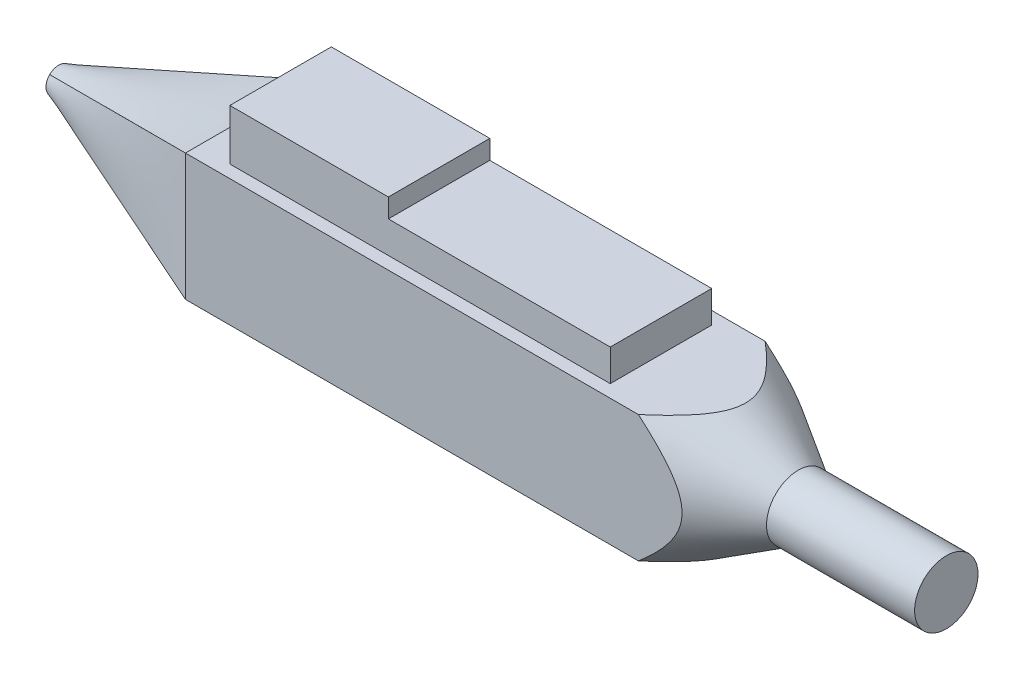
ISO-10303-21;
HEADER;
FILE_DESCRIPTION(('STEP AP214'),'2;1');
FILE_NAME('part.step','',(''),(''),'','','');
FILE_SCHEMA(('AUTOMOTIVE_DESIGN { 1 0 10303 214 1 1 1 1 }'));
ENDSEC;
DATA;
#1=APPLICATION_CONTEXT('core data for automotive mechanical design processes');
#2=APPLICATION_PROTOCOL_DEFINITION('international standard','automotive_design',2000,#1);
#3=PRODUCT_CONTEXT('',#1,'mechanical');
#4=PRODUCT('Part','Part','',(#3));
#5=PRODUCT_RELATED_PRODUCT_CATEGORY('part','',(#4));
#6=PRODUCT_DEFINITION_FORMATION('','',#4);
#7=PRODUCT_DEFINITION_CONTEXT('part definition',#1,'design');
#8=PRODUCT_DEFINITION('design','',#6,#7);
#9=PRODUCT_DEFINITION_SHAPE('','',#8);
#10=(LENGTH_UNIT() NAMED_UNIT(*) SI_UNIT(.MILLI.,.METRE.));
#11=(NAMED_UNIT(*) PLANE_ANGLE_UNIT() SI_UNIT($,.RADIAN.));
#12=(NAMED_UNIT(*) SI_UNIT($,.STERADIAN.) SOLID_ANGLE_UNIT());
#13=UNCERTAINTY_MEASURE_WITH_UNIT(LENGTH_MEASURE(1.E-05),#10,'distance_accuracy_value','');
#14=(GEOMETRIC_REPRESENTATION_CONTEXT(3) GLOBAL_UNCERTAINTY_ASSIGNED_CONTEXT((#13)) GLOBAL_UNIT_ASSIGNED_CONTEXT((#10,
#11,#12)) REPRESENTATION_CONTEXT('',''));
#15=CARTESIAN_POINT('',(0.,0.,0.));
#16=DIRECTION('',(0.,0.,1.));
#17=DIRECTION('',(1.,0.,0.));
#18=AXIS2_PLACEMENT_3D('',#15,#16,#17);
#19=CARTESIAN_POINT('',(0.,15.,0.));
#20=DIRECTION('',(0.,-1.,0.));
#21=DIRECTION('',(0.,0.,-1.));
#22=AXIS2_PLACEMENT_3D('',#19,#20,#21);
#23=PLANE('',#22);
#24=DIRECTION('',(0.,0.,-1.));
#25=VECTOR('',#24,1.);
#26=CARTESIAN_POINT('',(-5.,15.,-8.));
#27=LINE('',#26,#25);
#28=CARTESIAN_POINT('',(-5.,15.,8.));
#29=VERTEX_POINT('',#28);
#30=CARTESIAN_POINT('',(-5.,15.,-8.));
#31=VERTEX_POINT('',#30);
#32=EDGE_CURVE('E100',#29,#31,#27,.T.);
#33=ORIENTED_EDGE('',*,*,#32,.F.);
#34=DIRECTION('',(1.,0.,0.));
#35=VECTOR('',#34,1.);
#36=CARTESIAN_POINT('',(-30.,15.,8.));
#37=LINE('',#36,#35);
#38=CARTESIAN_POINT('',(30.,15.,8.));
#39=VERTEX_POINT('',#38);
#40=EDGE_CURVE('E224',#29,#39,#37,.T.);
#41=ORIENTED_EDGE('',*,*,#40,.T.);
#42=DIRECTION('',(0.,0.,-1.));
#43=VECTOR('',#42,1.);
#44=CARTESIAN_POINT('',(30.,15.,8.));
#45=LINE('',#44,#43);
#46=CARTESIAN_POINT('',(30.,15.,-8.));
#47=VERTEX_POINT('',#46);
#48=EDGE_CURVE('E216',#39,#47,#45,.T.);
#49=ORIENTED_EDGE('',*,*,#48,.T.);
#50=DIRECTION('',(-1.,0.,0.));
#51=VECTOR('',#50,1.);
#52=CARTESIAN_POINT('',(-30.,15.,-8.));
#53=LINE('',#52,#51);
#54=EDGE_CURVE('E220',#47,#31,#53,.T.);
#55=ORIENTED_EDGE('',*,*,#54,.T.);
#56=EDGE_LOOP('',(#33,#41,#49,#55));
#57=FACE_BOUND('',#56,.T.);
#58=ADVANCED_FACE('F77',(#57),#23,.F.);
#59=CARTESIAN_POINT('',(-35.,10.,-10.));
#60=DIRECTION('',(0.,1.,0.));
#61=DIRECTION('',(0.,0.,1.));
#62=AXIS2_PLACEMENT_3D('',#59,#60,#61);
#63=PLANE('',#62);
#64=DIRECTION('',(0.,0.,1.));
#65=VECTOR('',#64,1.);
#66=CARTESIAN_POINT('',(-35.,10.,-10.));
#67=LINE('',#66,#65);
#68=CARTESIAN_POINT('',(-35.,10.,-10.));
#69=VERTEX_POINT('',#68);
#70=CARTESIAN_POINT('',(-35.,10.,10.));
#71=VERTEX_POINT('',#70);
#72=EDGE_CURVE('E316',#69,#71,#67,.T.);
#73=ORIENTED_EDGE('',*,*,#72,.T.);
#74=DIRECTION('',(-1.,0.,0.));
#75=VECTOR('',#74,1.);
#76=CARTESIAN_POINT('',(-35.,10.,10.));
#77=LINE('',#76,#75);
#78=CARTESIAN_POINT('',(36.4277260800642,10.,10.));
#79=VERTEX_POINT('',#78);
#80=EDGE_CURVE('E323',#79,#71,#77,.T.);
#81=ORIENTED_EDGE('',*,*,#80,.F.);
#82=CARTESIAN_POINT('',(36.4277260800642,10.,10.));
#83=CARTESIAN_POINT('',(36.6579701905072,10.,9.80431700209805));
#84=CARTESIAN_POINT('',(36.8868402030193,10.,9.60699599659866));
#85=CARTESIAN_POINT('',(37.3412880846106,10.,9.20851020861762));
#86=CARTESIAN_POINT('',(37.5668652790757,10.,9.00734465745292));
#87=CARTESIAN_POINT('',(38.0154089206724,10.,8.59948141561774));
#88=CARTESIAN_POINT('',(38.2383521223816,10.,8.39275809408566));
#89=CARTESIAN_POINT('',(38.6794427460789,10.,7.97427421978591));
#90=CARTESIAN_POINT('',(38.8975904834556,10.,7.76251400020425));
#91=CARTESIAN_POINT('',(39.3358964050225,10.,7.32535955670521));
#92=CARTESIAN_POINT('',(39.5558400347789,10.,7.09974946314896));
#93=CARTESIAN_POINT('',(39.9880225612236,10.,6.64117396667784));
#94=CARTESIAN_POINT('',(40.200260373825,10.,6.40820753739615));
#95=CARTESIAN_POINT('',(40.6144833976441,10.,5.93427125050396));
#96=CARTESIAN_POINT('',(40.816491847635,10.,5.69332179989841));
#97=CARTESIAN_POINT('',(41.2080241019846,10.,5.20153839624695));
#98=CARTESIAN_POINT('',(41.3975526800176,10.,4.95070828202222));
#99=CARTESIAN_POINT('',(41.7078311068682,10.,4.51195125776544));
#100=CARTESIAN_POINT('',(41.8325927164225,10.,4.32686662735559));
#101=CARTESIAN_POINT('',(42.0722419483505,10.,3.95031636208399));
#102=CARTESIAN_POINT('',(42.1871276477973,10.,3.75884949457058));
#103=CARTESIAN_POINT('',(42.4043355985667,10.,3.37009083425741));
#104=CARTESIAN_POINT('',(42.5067160988686,10.,3.17283180864254));
#105=CARTESIAN_POINT('',(42.6970310222163,10.,2.77143710628962));
#106=CARTESIAN_POINT('',(42.7849685182514,10.,2.56730290352717));
#107=CARTESIAN_POINT('',(42.9300306177258,10.,2.18780015311988));
#108=CARTESIAN_POINT('',(42.9898525563668,10.,2.01346640770079));
#109=CARTESIAN_POINT('',(43.0959306438249,10.,1.66069593327497));
#110=CARTESIAN_POINT('',(43.1421881152691,10.,1.48225960612854));
#111=CARTESIAN_POINT('',(43.2195313105477,10.,1.12235331438243));
#112=CARTESIAN_POINT('',(43.2506377885369,10.,0.940887853812675));
#113=CARTESIAN_POINT('',(43.2965725637487,10.,0.575890418109581));
#114=CARTESIAN_POINT('',(43.3114013120031,10.,0.392358500377088));
#115=CARTESIAN_POINT('',(43.3241857413195,10.,0.0238794025062155));
#116=CARTESIAN_POINT('',(43.3220657766808,10.,-0.161070437689557));
#117=CARTESIAN_POINT('',(43.3008653252348,10.,-0.529983521345133));
#118=CARTESIAN_POINT('',(43.2817847963648,10.,-0.71394676235701));
#119=CARTESIAN_POINT('',(43.2274365851684,10.,-1.07959788229485));
#120=CARTESIAN_POINT('',(43.1921555363982,10.,-1.26128375484135));
#121=CARTESIAN_POINT('',(43.1067368123953,10.,-1.62111059711777));
#122=CARTESIAN_POINT('',(43.0565969282474,10.,-1.79925103557839));
#123=CARTESIAN_POINT('',(42.9210531798147,10.,-2.21952676508635));
#124=CARTESIAN_POINT('',(42.8295146187087,10.,-2.45968492459424));
#125=CARTESIAN_POINT('',(42.625445706637,10.,-2.93089198921819));
#126=CARTESIAN_POINT('',(42.5129041744265,10.,-3.16193596252655));
#127=CARTESIAN_POINT('',(42.2698580028304,10.,-3.61699418346018));
#128=CARTESIAN_POINT('',(42.1391991859239,10.,-3.84092530466756));
#129=CARTESIAN_POINT('',(41.8642311877281,10.,-4.28007549301963));
#130=CARTESIAN_POINT('',(41.7199257143812,10.,-4.4952969041205));
#131=CARTESIAN_POINT('',(41.387598227494,10.,-4.9642071843985));
#132=CARTESIAN_POINT('',(41.1969208253946,10.,-5.2160053568361));
#133=CARTESIAN_POINT('',(40.8030399890308,10.,-5.70966391819909));
#134=CARTESIAN_POINT('',(40.5998319962701,10.,-5.9515206365656));
#135=CARTESIAN_POINT('',(40.1831932466239,10.,-6.42720957716263));
#136=CARTESIAN_POINT('',(39.9697399036085,10.,-6.6610219171918));
#137=CARTESIAN_POINT('',(39.5351066951517,10.,-7.12125821387428));
#138=CARTESIAN_POINT('',(39.3139278800305,10.,-7.34768316685006));
#139=CARTESIAN_POINT('',(38.8761273606315,10.,-7.78348401085992));
#140=CARTESIAN_POINT('',(38.6597991706379,10.,-7.99315582198255));
#141=CARTESIAN_POINT('',(38.2224584034069,10.,-8.40757183318024));
#142=CARTESIAN_POINT('',(38.0014455424798,10.,-8.61231573322305));
#143=CARTESIAN_POINT('',(37.5568037805587,10.,-9.0163492750656));
#144=CARTESIAN_POINT('',(37.333197095975,10.,-9.21566342931389));
#145=CARTESIAN_POINT('',(36.8827520578375,10.,-9.61052105445092));
#146=CARTESIAN_POINT('',(36.6559143331247,10.,-9.80606524209425));
#147=CARTESIAN_POINT('',(36.4277260800642,10.,-10.));
#148=B_SPLINE_CURVE_WITH_KNOTS('',3,(#82,#83,#84,#85,#86,#87,#88,#89,#90,#91,#92,#93,#94,#95,
#96,#97,#98,#99,#100,#101,#102,#103,#104,#105,#106,#107,#108,#109,#110,#111,#112,#113,#114,#115,
#116,#117,#118,#119,#120,#121,#122,#123,#124,#125,#126,#127,#128,#129,#130,#131,#132,#133,#134,
#135,#136,#137,#138,#139,#140,#141,#142,#143,#144,#145,#146,#147),.UNSPECIFIED.,.F.,.F.,(4,2,2,
2,2,2,2,2,2,2,2,2,2,2,2,2,2,2,2,2,2,2,2,2,2,2,2,2,2,2,2,2,4),(0.,0.906510326435434,
1.81320383818188,2.72524506526281,3.63722612854821,4.58231754932622,5.52754141840162,
6.47051158573985,7.41311893683248,8.08249124235044,8.75199358673786,9.4182477538633,
10.0843599801869,10.6368167197363,11.1892195731001,11.7408635901011,12.292492321473,
12.8465844587537,13.4006779701991,13.9552294672094,14.5098634452661,15.2796143983178,
16.0497763148183,16.8269482925417,17.6039097077498,18.5509258702119,19.4982886031892,
20.4478454472875,21.397273692627,22.3009782796597,23.2047377496095,24.1033239435833,
25.0017375771655),.UNSPECIFIED.);
#149=CARTESIAN_POINT('',(36.4277260800642,10.,-10.));
#150=VERTEX_POINT('',#149);
#151=EDGE_CURVE('E93',#79,#150,#148,.T.);
#152=ORIENTED_EDGE('',*,*,#151,.T.);
#153=DIRECTION('',(-1.,0.,0.));
#154=VECTOR('',#153,1.);
#155=CARTESIAN_POINT('',(-35.,10.,-10.));
#156=LINE('',#155,#154);
#157=EDGE_CURVE('E318',#150,#69,#156,.T.);
#158=ORIENTED_EDGE('',*,*,#157,.T.);
#159=EDGE_LOOP('',(#73,#81,#152,#158));
#160=FACE_BOUND('',#159,.T.);
#161=DIRECTION('',(-1.,0.,0.));
#162=VECTOR('',#161,1.);
#163=CARTESIAN_POINT('',(-30.,10.,-8.));
#164=LINE('',#163,#162);
#165=CARTESIAN_POINT('',(30.,10.,-8.));
#166=VERTEX_POINT('',#165);
#167=CARTESIAN_POINT('',(-30.,10.,-8.));
#168=VERTEX_POINT('',#167);
#169=EDGE_CURVE('E230',#166,#168,#164,.T.);
#170=ORIENTED_EDGE('',*,*,#169,.F.);
#171=DIRECTION('',(0.,0.,-1.));
#172=VECTOR('',#171,1.);
#173=CARTESIAN_POINT('',(30.,10.,8.));
#174=LINE('',#173,#172);
#175=CARTESIAN_POINT('',(30.,10.,8.));
#176=VERTEX_POINT('',#175);
#177=EDGE_CURVE('E215',#176,#166,#174,.T.);
#178=ORIENTED_EDGE('',*,*,#177,.F.);
#179=DIRECTION('',(1.,0.,0.));
#180=VECTOR('',#179,1.);
#181=CARTESIAN_POINT('',(-30.,10.,8.));
#182=LINE('',#181,#180);
#183=CARTESIAN_POINT('',(-30.,10.,8.));
#184=VERTEX_POINT('',#183);
#185=EDGE_CURVE('E221',#184,#176,#182,.T.);
#186=ORIENTED_EDGE('',*,*,#185,.F.);
#187=DIRECTION('',(0.,0.,1.));
#188=VECTOR('',#187,1.);
#189=CARTESIAN_POINT('',(-30.,10.,8.));
#190=LINE('',#189,#188);
#191=EDGE_CURVE('E180',#168,#184,#190,.T.);
#192=ORIENTED_EDGE('',*,*,#191,.F.);
#193=EDGE_LOOP('',(#170,#178,#186,#192));
#194=FACE_BOUND('',#193,.T.);
#195=ADVANCED_FACE('F372',(#160,#194),#63,.T.);
#196=CARTESIAN_POINT('',(-35.,-10.,-10.));
#197=DIRECTION('',(0.,-1.,0.));
#198=DIRECTION('',(0.,0.,-1.));
#199=AXIS2_PLACEMENT_3D('',#196,#197,#198);
#200=PLANE('',#199);
#201=DIRECTION('',(1.,0.,0.));
#202=VECTOR('',#201,1.);
#203=CARTESIAN_POINT('',(-35.,-10.,-10.));
#204=LINE('',#203,#202);
#205=CARTESIAN_POINT('',(-35.,-10.,-10.));
#206=VERTEX_POINT('',#205);
#207=CARTESIAN_POINT('',(36.4277260800642,-10.,-10.));
#208=VERTEX_POINT('',#207);
#209=EDGE_CURVE('E308',#206,#208,#204,.T.);
#210=ORIENTED_EDGE('',*,*,#209,.T.);
#211=CARTESIAN_POINT('',(36.4277260800642,-10.,-10.));
#212=CARTESIAN_POINT('',(36.6579701905072,-10.,-9.80431700209805));
#213=CARTESIAN_POINT('',(36.8868402030193,-10.,-9.60699599659866));
#214=CARTESIAN_POINT('',(37.3412880846106,-10.,-9.20851020861763));
#215=CARTESIAN_POINT('',(37.5668652790757,-10.,-9.00734465745293));
#216=CARTESIAN_POINT('',(38.0154089206724,-10.,-8.59948141561774));
#217=CARTESIAN_POINT('',(38.2383521223816,-10.,-8.39275809408566));
#218=CARTESIAN_POINT('',(38.6794427460789,-10.,-7.97427421978591));
#219=CARTESIAN_POINT('',(38.8975904834556,-10.,-7.76251400020426));
#220=CARTESIAN_POINT('',(39.3358964050225,-10.,-7.32535955670522));
#221=CARTESIAN_POINT('',(39.5558400347789,-10.,-7.09974946314897));
#222=CARTESIAN_POINT('',(39.9880225612237,-10.,-6.64117396667784));
#223=CARTESIAN_POINT('',(40.200260373825,-10.,-6.40820753739615));
#224=CARTESIAN_POINT('',(40.6144833976441,-10.,-5.93427125050396));
#225=CARTESIAN_POINT('',(40.816491847635,-10.,-5.69332179989841));
#226=CARTESIAN_POINT('',(41.2080241019846,-10.,-5.20153839624695));
#227=CARTESIAN_POINT('',(41.3975526800176,-10.,-4.95070828202222));
#228=CARTESIAN_POINT('',(41.7078311068682,-10.,-4.51195125776544));
#229=CARTESIAN_POINT('',(41.8325927164226,-10.,-4.32686662735559));
#230=CARTESIAN_POINT('',(42.0722419483505,-10.,-3.95031636208399));
#231=CARTESIAN_POINT('',(42.1871276477974,-10.,-3.75884949457058));
#232=CARTESIAN_POINT('',(42.4043355985667,-10.,-3.37009083425741));
#233=CARTESIAN_POINT('',(42.5067160988686,-10.,-3.17283180864255));
#234=CARTESIAN_POINT('',(42.6970310222164,-10.,-2.77143710628962));
#235=CARTESIAN_POINT('',(42.7849685182514,-10.,-2.56730290352717));
#236=CARTESIAN_POINT('',(42.9300306177258,-10.,-2.18780015311989));
#237=CARTESIAN_POINT('',(42.9898525563668,-10.,-2.0134664077008));
#238=CARTESIAN_POINT('',(43.0959306438249,-10.,-1.66069593327497));
#239=CARTESIAN_POINT('',(43.1421881152691,-10.,-1.48225960612855));
#240=CARTESIAN_POINT('',(43.2195313105477,-10.,-1.12235331438243));
#241=CARTESIAN_POINT('',(43.2506377885369,-10.,-0.940887853812678));
#242=CARTESIAN_POINT('',(43.2965725637487,-10.,-0.575890418109582));
#243=CARTESIAN_POINT('',(43.3114013120031,-10.,-0.392358500377087));
#244=CARTESIAN_POINT('',(43.3241857413195,-10.,-0.023879402506213));
#245=CARTESIAN_POINT('',(43.3220657766808,-10.,0.16107043768956));
#246=CARTESIAN_POINT('',(43.3008653252348,-10.,0.529983521345135));
#247=CARTESIAN_POINT('',(43.2817847963648,-10.,0.713946762357011));
#248=CARTESIAN_POINT('',(43.2274365851684,-10.,1.07959788229485));
#249=CARTESIAN_POINT('',(43.1921555363982,-10.,1.26128375484136));
#250=CARTESIAN_POINT('',(43.1067368123954,-10.,1.62111059711777));
#251=CARTESIAN_POINT('',(43.0565969282474,-10.,1.79925103557839));
#252=CARTESIAN_POINT('',(42.9210531798147,-10.,2.21952676508635));
#253=CARTESIAN_POINT('',(42.8295146187087,-10.,2.45968492459425));
#254=CARTESIAN_POINT('',(42.625445706637,-10.,2.93089198921819));
#255=CARTESIAN_POINT('',(42.5129041744265,-10.,3.16193596252655));
#256=CARTESIAN_POINT('',(42.2698580028304,-10.,3.61699418346018));
#257=CARTESIAN_POINT('',(42.1391991859239,-10.,3.84092530466756));
#258=CARTESIAN_POINT('',(41.8642311877281,-10.,4.28007549301964));
#259=CARTESIAN_POINT('',(41.7199257143812,-10.,4.49529690412051));
#260=CARTESIAN_POINT('',(41.387598227494,-10.,4.96420718439851));
#261=CARTESIAN_POINT('',(41.1969208253946,-10.,5.2160053568361));
#262=CARTESIAN_POINT('',(40.8030399890308,-10.,5.7096639181991));
#263=CARTESIAN_POINT('',(40.5998319962701,-10.,5.9515206365656));
#264=CARTESIAN_POINT('',(40.1831932466239,-10.,6.42720957716264));
#265=CARTESIAN_POINT('',(39.9697399036085,-10.,6.6610219171918));
#266=CARTESIAN_POINT('',(39.5351066951517,-10.,7.12125821387428));
#267=CARTESIAN_POINT('',(39.3139278800305,-10.,7.34768316685006));
#268=CARTESIAN_POINT('',(38.8761273606315,-10.,7.78348401085992));
#269=CARTESIAN_POINT('',(38.6597991706379,-10.,7.99315582198255));
#270=CARTESIAN_POINT('',(38.2224584034069,-10.,8.40757183318024));
#271=CARTESIAN_POINT('',(38.0014455424798,-10.,8.61231573322304));
#272=CARTESIAN_POINT('',(37.5568037805587,-10.,9.0163492750656));
#273=CARTESIAN_POINT('',(37.333197095975,-10.,9.21566342931389));
#274=CARTESIAN_POINT('',(36.8827520578375,-10.,9.61052105445092));
#275=CARTESIAN_POINT('',(36.6559143331247,-10.,9.80606524209425));
#276=CARTESIAN_POINT('',(36.4277260800642,-10.,10.));
#277=B_SPLINE_CURVE_WITH_KNOTS('',3,(#211,#212,#213,#214,#215,#216,#217,#218,#219,#220,#221,
#222,#223,#224,#225,#226,#227,#228,#229,#230,#231,#232,#233,#234,#235,#236,#237,#238,#239,#240,
#241,#242,#243,#244,#245,#246,#247,#248,#249,#250,#251,#252,#253,#254,#255,#256,#257,#258,#259,
#260,#261,#262,#263,#264,#265,#266,#267,#268,#269,#270,#271,#272,#273,#274,#275,#276),
.UNSPECIFIED.,.F.,.F.,(4,2,2,2,2,2,2,2,2,2,2,2,2,2,2,2,2,2,2,2,2,2,2,2,2,2,2,2,2,2,2,2,4),(0.,
0.906510326435433,1.81320383818187,2.72524506526281,3.63722612854821,4.58231754932622,
5.52754141840163,6.47051158573986,7.41311893683249,8.08249124235045,8.75199358673786,
9.4182477538633,10.0843599801869,10.6368167197363,11.1892195731001,11.7408635901011,
12.292492321473,12.8465844587537,13.4006779701991,13.9552294672094,14.5098634452661,
15.2796143983178,16.0497763148183,16.8269482925417,17.6039097077498,18.5509258702119,
19.4982886031892,20.4478454472875,21.397273692627,22.3009782796597,23.2047377496095,
24.1033239435833,25.0017375771655),.UNSPECIFIED.);
#278=CARTESIAN_POINT('',(36.4277260800642,-10.,10.));
#279=VERTEX_POINT('',#278);
#280=EDGE_CURVE('E354',#208,#279,#277,.T.);
#281=ORIENTED_EDGE('',*,*,#280,.T.);
#282=DIRECTION('',(1.,0.,0.));
#283=VECTOR('',#282,1.);
#284=CARTESIAN_POINT('',(-35.,-10.,10.));
#285=LINE('',#284,#283);
#286=CARTESIAN_POINT('',(-35.,-10.,10.));
#287=VERTEX_POINT('',#286);
#288=EDGE_CURVE('E322',#287,#279,#285,.T.);
#289=ORIENTED_EDGE('',*,*,#288,.F.);
#290=DIRECTION('',(0.,0.,-1.));
#291=VECTOR('',#290,1.);
#292=CARTESIAN_POINT('',(-35.,-10.,-10.));
#293=LINE('',#292,#291);
#294=EDGE_CURVE('E331',#206,#287,#293,.F.);
#295=ORIENTED_EDGE('',*,*,#294,.F.);
#296=EDGE_LOOP('',(#210,#281,#289,#295));
#297=FACE_BOUND('',#296,.T.);
#298=ADVANCED_FACE('F365',(#297),#200,.T.);
#299=CARTESIAN_POINT('',(0.,0.,-10.));
#300=DIRECTION('',(0.,0.,-1.));
#301=DIRECTION('',(-1.,0.,0.));
#302=AXIS2_PLACEMENT_3D('',#299,#300,#301);
#303=PLANE('',#302);
#304=ORIENTED_EDGE('',*,*,#157,.F.);
#305=CARTESIAN_POINT('',(36.4277260800642,10.,-10.));
#306=CARTESIAN_POINT('',(36.6583803846559,9.80396813106534,-10.));
#307=CARTESIAN_POINT('',(36.887655979535,9.6062925015474,-10.));
#308=CARTESIAN_POINT('',(37.3429033595852,9.20708185003049,-10.));
#309=CARTESIAN_POINT('',(37.5688744500061,9.00554603645456,-10.));
#310=CARTESIAN_POINT('',(38.0179821265151,8.59711285705338,-10.));
#311=CARTESIAN_POINT('',(38.2410990763051,8.39019384417617,-10.));
#312=CARTESIAN_POINT('',(38.6825249799105,7.9713074534069,-10.));
#313=CARTESIAN_POINT('',(38.900834269766,7.75934043052419,-10.));
#314=CARTESIAN_POINT('',(39.3265832332469,7.33458702738383,-10.));
#315=CARTESIAN_POINT('',(39.5341577359293,7.12193617499052,-10.));
#316=CARTESIAN_POINT('',(39.9424841124613,6.69018847009781,-10.));
#317=CARTESIAN_POINT('',(40.1432365302668,6.47109213413733,-10.));
#318=CARTESIAN_POINT('',(40.5359389889621,6.02579655908473,-10.));
#319=CARTESIAN_POINT('',(40.7279037618115,5.79961036531046,-10.));
#320=CARTESIAN_POINT('',(41.1011720477513,5.33864784235459,-10.));
#321=CARTESIAN_POINT('',(41.2824787958828,5.10387415521047,-10.));
#322=CARTESIAN_POINT('',(41.5790938428082,4.69641419770352,-10.));
#323=CARTESIAN_POINT('',(41.6978705690616,4.52625618051693,-10.));
#324=CARTESIAN_POINT('',(41.9274457873825,4.18067397582406,-10.));
#325=CARTESIAN_POINT('',(42.0382461440293,4.00525103273687,-10.));
#326=CARTESIAN_POINT('',(42.251148874324,3.64734284402808,-10.));
#327=CARTESIAN_POINT('',(42.3531787142197,3.46481404495236,-10.));
#328=CARTESIAN_POINT('',(42.5457077681673,3.09352526517441,-10.));
#329=CARTESIAN_POINT('',(42.6361934198317,2.90475827745122,-10.));
#330=CARTESIAN_POINT('',(42.7198440490223,2.71286572143321,-10.));
#331=B_SPLINE_CURVE_WITH_KNOTS('',3,(#305,#306,#307,#308,#309,#310,#311,#312,#313,#314,#315,
#316,#317,#318,#319,#320,#321,#322,#323,#324,#325,#326,#327,#328,#329,#330),.UNSPECIFIED.,.F.,
.F.,(4,2,2,2,2,2,2,2,2,2,2,2,4),(0.,0.908126124435932,1.81644050814374,2.72926333478714,
3.64202215418167,4.53339776252417,5.4247021298795,6.31445302937457,7.2039324523734,
7.82628776799343,8.44849712439866,9.07543702499829,9.70310681678607),.UNSPECIFIED.);
#332=CARTESIAN_POINT('',(42.7198440490223,2.71286572143326,-10.));
#333=VERTEX_POINT('',#332);
#334=EDGE_CURVE('E12',#150,#333,#331,.T.);
#335=ORIENTED_EDGE('',*,*,#334,.T.);
#336=CARTESIAN_POINT('',(42.7198440490223,2.71286572143326,-10.));
#337=CARTESIAN_POINT('',(42.7943721442816,2.54189083301518,-10.));
#338=CARTESIAN_POINT('',(42.8633902616501,2.36838901737678,-10.));
#339=CARTESIAN_POINT('',(42.9887707598742,2.01659800696181,-10.));
#340=CARTESIAN_POINT('',(43.0451141223097,1.83830206147723,-10.));
#341=CARTESIAN_POINT('',(43.1431861372235,1.4780351518557,-10.));
#342=CARTESIAN_POINT('',(43.1849415912515,1.29607158383614,-10.));
#343=CARTESIAN_POINT('',(43.2524432025641,0.929269990598683,-10.));
#344=CARTESIAN_POINT('',(43.2781977191863,0.744433518090476,-10.));
#345=CARTESIAN_POINT('',(43.3128333514659,0.371399012504267,-10.));
#346=CARTESIAN_POINT('',(43.3215523976911,0.183185721497938,-10.));
#347=CARTESIAN_POINT('',(43.3212382135592,-0.19324753429364,-10.));
#348=CARTESIAN_POINT('',(43.3122028248433,-0.381467497108377,-10.));
#349=CARTESIAN_POINT('',(43.2768350019264,-0.755661389465241,-10.));
#350=CARTESIAN_POINT('',(43.2505569460959,-0.941640514340922,-10.));
#351=CARTESIAN_POINT('',(43.1818533042049,-1.31056998810603,-10.));
#352=CARTESIAN_POINT('',(43.1394259810083,-1.49352000895239,-10.));
#353=CARTESIAN_POINT('',(43.0265184131462,-1.90430879805331,-10.));
#354=CARTESIAN_POINT('',(42.9515552704378,-2.13091404868043,-10.));
#355=CARTESIAN_POINT('',(42.7816694484503,-2.57649327736518,-10.));
#356=CARTESIAN_POINT('',(42.6867383674268,-2.79546399774958,-10.));
#357=CARTESIAN_POINT('',(42.4791367575941,-3.22819286972412,-10.));
#358=CARTESIAN_POINT('',(42.3662554703809,-3.44184895569871,-10.));
#359=CARTESIAN_POINT('',(42.1268555859097,-3.86121883457495,-10.));
#360=CARTESIAN_POINT('',(42.0003408481684,-4.06693485296339,-10.));
#361=CARTESIAN_POINT('',(41.6817138722408,-4.55457620055053,-10.));
#362=CARTESIAN_POINT('',(41.4840889514337,-4.83288818055061,-10.));
#363=CARTESIAN_POINT('',(41.0722928320057,-5.37707765887001,-10.));
#364=CARTESIAN_POINT('',(40.858111871709,-5.64294767062674,-10.));
#365=CARTESIAN_POINT('',(40.41646432822,-6.16494068297616,-10.));
#366=CARTESIAN_POINT('',(40.1889540252618,-6.42102646587357,-10.));
#367=CARTESIAN_POINT('',(39.7242451928393,-6.92409427661164,-10.));
#368=CARTESIAN_POINT('',(39.4870487927675,-7.17107828291528,-10.));
#369=CARTESIAN_POINT('',(39.0206239730129,-7.64163300291066,-10.));
#370=CARTESIAN_POINT('',(38.7918770530502,-7.86568311134921,-10.));
#371=CARTESIAN_POINT('',(38.3289067277146,-8.30807627051551,-10.));
#372=CARTESIAN_POINT('',(38.0946828700114,-8.52641884669238,-10.));
#373=CARTESIAN_POINT('',(37.6237199633797,-8.95637438829246,-10.));
#374=CARTESIAN_POINT('',(37.3870181713797,-9.16802828626374,-10.));
#375=CARTESIAN_POINT('',(36.9099559910074,-9.58705540952215,-10.));
#376=CARTESIAN_POINT('',(36.6695965258582,-9.79442968487262,-10.));
#377=CARTESIAN_POINT('',(36.4277260800642,-10.,-10.));
#378=B_SPLINE_CURVE_WITH_KNOTS('',3,(#336,#337,#338,#339,#340,#341,#342,#343,#344,#345,#346,
#347,#348,#349,#350,#351,#352,#353,#354,#355,#356,#357,#358,#359,#360,#361,#362,#363,#364,#365,
#366,#367,#368,#369,#370,#371,#372,#373,#374,#375,#376,#377),.UNSPECIFIED.,.F.,.F.,(4,2,2,2,2,2,
2,2,2,2,2,2,2,2,2,2,2,2,2,2,4),(0.,0.559611595533989,1.12005736676538,1.67946797945524,
2.23858609408699,2.8029980472093,3.36747861861951,3.9301874834116,4.4929568944929,
5.20784532750737,5.92303516209302,6.64734425899415,7.37144884598802,8.39460104731888,
9.4183611839631,10.4456909170785,11.472796005142,12.4332623194178,13.3938082389665,
14.34634490288,15.2986450014383),.UNSPECIFIED.);
#379=EDGE_CURVE('E346',#333,#208,#378,.T.);
#380=ORIENTED_EDGE('',*,*,#379,.T.);
#381=ORIENTED_EDGE('',*,*,#209,.F.);
#382=DIRECTION('',(0.,1.,0.));
#383=VECTOR('',#382,1.);
#384=CARTESIAN_POINT('',(-35.,0.,-10.));
#385=LINE('',#384,#383);
#386=EDGE_CURVE('E317',#69,#206,#385,.F.);
#387=ORIENTED_EDGE('',*,*,#386,.F.);
#388=EDGE_LOOP('',(#304,#335,#380,#381,#387));
#389=FACE_BOUND('',#388,.T.);
#390=ADVANCED_FACE('F361',(#389),#303,.T.);
#391=CARTESIAN_POINT('',(0.,0.,10.));
#392=DIRECTION('',(0.,0.,-1.));
#393=DIRECTION('',(-1.,0.,0.));
#394=AXIS2_PLACEMENT_3D('',#391,#392,#393);
#395=PLANE('',#394);
#396=ORIENTED_EDGE('',*,*,#288,.T.);
#397=CARTESIAN_POINT('',(36.4277260800642,-10.,10.));
#398=CARTESIAN_POINT('',(36.6579701905072,-9.80431700209804,10.));
#399=CARTESIAN_POINT('',(36.8868402030193,-9.60699599659866,10.));
#400=CARTESIAN_POINT('',(37.3412880846106,-9.20851020861762,10.));
#401=CARTESIAN_POINT('',(37.5668652790757,-9.00734465745292,10.));
#402=CARTESIAN_POINT('',(38.0154089206724,-8.59948141561774,10.));
#403=CARTESIAN_POINT('',(38.2383521223816,-8.39275809408566,10.));
#404=CARTESIAN_POINT('',(38.6794427460789,-7.97427421978591,10.));
#405=CARTESIAN_POINT('',(38.8975904834556,-7.76251400020426,10.));
#406=CARTESIAN_POINT('',(39.3358964050225,-7.32535955670521,10.));
#407=CARTESIAN_POINT('',(39.5558400347789,-7.09974946314896,10.));
#408=CARTESIAN_POINT('',(39.9880225612236,-6.64117396667784,10.));
#409=CARTESIAN_POINT('',(40.200260373825,-6.40820753739615,10.));
#410=CARTESIAN_POINT('',(40.6144833976441,-5.93427125050396,10.));
#411=CARTESIAN_POINT('',(40.816491847635,-5.69332179989841,10.));
#412=CARTESIAN_POINT('',(41.2080241019846,-5.20153839624695,10.));
#413=CARTESIAN_POINT('',(41.3975526800176,-4.95070828202222,10.));
#414=CARTESIAN_POINT('',(41.7078311068682,-4.51195125776545,10.));
#415=CARTESIAN_POINT('',(41.8325927164225,-4.3268666273556,10.));
#416=CARTESIAN_POINT('',(42.0722419483505,-3.950316362084,10.));
#417=CARTESIAN_POINT('',(42.1871276477973,-3.75884949457059,10.));
#418=CARTESIAN_POINT('',(42.4043355985667,-3.37009083425742,10.));
#419=CARTESIAN_POINT('',(42.5067160988686,-3.17283180864255,10.));
#420=CARTESIAN_POINT('',(42.6970310222163,-2.77143710628963,10.));
#421=CARTESIAN_POINT('',(42.7849685182514,-2.56730290352718,10.));
#422=CARTESIAN_POINT('',(42.9300306177258,-2.18780015311989,10.));
#423=CARTESIAN_POINT('',(42.9898525563668,-2.0134664077008,10.));
#424=CARTESIAN_POINT('',(43.0959306438249,-1.66069593327498,10.));
#425=CARTESIAN_POINT('',(43.1421881152691,-1.48225960612855,10.));
#426=CARTESIAN_POINT('',(43.2195313105477,-1.12235331438243,10.));
#427=CARTESIAN_POINT('',(43.2506377885369,-0.940887853812679,10.));
#428=CARTESIAN_POINT('',(43.2965725637487,-0.575890418109583,10.));
#429=CARTESIAN_POINT('',(43.3114013120031,-0.392358500377089,10.));
#430=CARTESIAN_POINT('',(43.3241857413195,-0.0238794025062159,10.));
#431=CARTESIAN_POINT('',(43.3220657766808,0.161070437689557,10.));
#432=CARTESIAN_POINT('',(43.3008653252348,0.529983521345133,10.));
#433=CARTESIAN_POINT('',(43.2817847963648,0.713946762357009,10.));
#434=CARTESIAN_POINT('',(43.2274365851684,1.07959788229485,10.));
#435=CARTESIAN_POINT('',(43.1921555363982,1.26128375484135,10.));
#436=CARTESIAN_POINT('',(43.1067368123953,1.62111059711777,10.));
#437=CARTESIAN_POINT('',(43.0565969282474,1.79925103557839,10.));
#438=CARTESIAN_POINT('',(42.9210531798147,2.21952676508635,10.));
#439=CARTESIAN_POINT('',(42.8295146187087,2.45968492459424,10.));
#440=CARTESIAN_POINT('',(42.625445706637,2.93089198921819,10.));
#441=CARTESIAN_POINT('',(42.5129041744265,3.16193596252655,10.));
#442=CARTESIAN_POINT('',(42.2698580028304,3.61699418346018,10.));
#443=CARTESIAN_POINT('',(42.1391991859239,3.84092530466756,10.));
#444=CARTESIAN_POINT('',(41.8642311877281,4.28007549301963,10.));
#445=CARTESIAN_POINT('',(41.7199257143812,4.49529690412051,10.));
#446=CARTESIAN_POINT('',(41.387598227494,4.96420718439851,10.));
#447=CARTESIAN_POINT('',(41.1969208253946,5.2160053568361,10.));
#448=CARTESIAN_POINT('',(40.8030399890308,5.7096639181991,10.));
#449=CARTESIAN_POINT('',(40.5998319962701,5.9515206365656,10.));
#450=CARTESIAN_POINT('',(40.1831932466239,6.42720957716264,10.));
#451=CARTESIAN_POINT('',(39.9697399036085,6.6610219171918,10.));
#452=CARTESIAN_POINT('',(39.5351066951517,7.12125821387428,10.));
#453=CARTESIAN_POINT('',(39.3139278800305,7.34768316685006,10.));
#454=CARTESIAN_POINT('',(38.8761273606315,7.78348401085992,10.));
#455=CARTESIAN_POINT('',(38.6597991706379,7.99315582198255,10.));
#456=CARTESIAN_POINT('',(38.2224584034069,8.40757183318024,10.));
#457=CARTESIAN_POINT('',(38.0014455424798,8.61231573322304,10.));
#458=CARTESIAN_POINT('',(37.5568037805587,9.0163492750656,10.));
#459=CARTESIAN_POINT('',(37.333197095975,9.21566342931388,10.));
#460=CARTESIAN_POINT('',(36.8827520578375,9.61052105445091,10.));
#461=CARTESIAN_POINT('',(36.6559143331247,9.80606524209424,10.));
#462=CARTESIAN_POINT('',(36.4277260800642,10.,10.));
#463=B_SPLINE_CURVE_WITH_KNOTS('',3,(#397,#398,#399,#400,#401,#402,#403,#404,#405,#406,#407,
#408,#409,#410,#411,#412,#413,#414,#415,#416,#417,#418,#419,#420,#421,#422,#423,#424,#425,#426,
#427,#428,#429,#430,#431,#432,#433,#434,#435,#436,#437,#438,#439,#440,#441,#442,#443,#444,#445,
#446,#447,#448,#449,#450,#451,#452,#453,#454,#455,#456,#457,#458,#459,#460,#461,#462),
.UNSPECIFIED.,.F.,.F.,(4,2,2,2,2,2,2,2,2,2,2,2,2,2,2,2,2,2,2,2,2,2,2,2,2,2,2,2,2,2,2,2,4),(0.,
0.906510326435433,1.81320383818187,2.72524506526281,3.63722612854821,4.58231754932623,
5.52754141840163,6.47051158573986,7.41311893683248,8.08249124235044,8.75199358673785,
9.41824775386329,10.0843599801869,10.6368167197363,11.1892195731001,11.7408635901011,
12.292492321473,12.8465844587537,13.4006779701991,13.9552294672094,14.5098634452661,
15.2796143983178,16.0497763148183,16.8269482925417,17.6039097077498,18.5509258702119,
19.4982886031892,20.4478454472875,21.397273692627,22.3009782796597,23.2047377496095,
24.1033239435833,25.0017375771655),.UNSPECIFIED.);
#464=EDGE_CURVE('E383',#279,#79,#463,.T.);
#465=ORIENTED_EDGE('',*,*,#464,.T.);
#466=ORIENTED_EDGE('',*,*,#80,.T.);
#467=DIRECTION('',(0.,1.,0.));
#468=VECTOR('',#467,1.);
#469=CARTESIAN_POINT('',(-35.,0.,10.));
#470=LINE('',#469,#468);
#471=EDGE_CURVE('E327',#71,#287,#470,.F.);
#472=ORIENTED_EDGE('',*,*,#471,.T.);
#473=EDGE_LOOP('',(#396,#465,#466,#472));
#474=FACE_BOUND('',#473,.T.);
#475=ADVANCED_FACE('F292',(#474),#395,.F.);
#476=CARTESIAN_POINT('',(-65.,0.,0.));
#477=DIRECTION('',(-1.,0.,0.));
#478=DIRECTION('',(0.,0.,1.));
#479=AXIS2_PLACEMENT_3D('',#476,#477,#478);
#480=PLANE('',#479);
#481=CARTESIAN_POINT('',(-65.,0.,0.));
#482=DIRECTION('',(-1.,0.,0.));
#483=DIRECTION('',(0.,0.,1.));
#484=AXIS2_PLACEMENT_3D('',#481,#482,#483);
#485=CIRCLE('',#484,2.);
#486=CARTESIAN_POINT('',(-65.,-1.4142135623731,1.41421356237309));
#487=VERTEX_POINT('',#486);
#488=CARTESIAN_POINT('',(-65.,1.41421356237309,1.41421356237309));
#489=VERTEX_POINT('',#488);
#490=EDGE_CURVE('E262',#487,#489,#485,.T.);
#491=ORIENTED_EDGE('',*,*,#490,.T.);
#492=CARTESIAN_POINT('',(-65.,1.4142135623731,-1.41421356237309));
#493=VERTEX_POINT('',#492);
#494=EDGE_CURVE('E266',#489,#493,#485,.T.);
#495=ORIENTED_EDGE('',*,*,#494,.T.);
#496=CARTESIAN_POINT('',(-65.,-1.41421356237309,-1.4142135623731));
#497=VERTEX_POINT('',#496);
#498=EDGE_CURVE('E270',#493,#497,#485,.T.);
#499=ORIENTED_EDGE('',*,*,#498,.T.);
#500=EDGE_CURVE('E249',#497,#487,#485,.T.);
#501=ORIENTED_EDGE('',*,*,#500,.T.);
#502=EDGE_LOOP('',(#491,#495,#499,#501));
#503=FACE_BOUND('',#502,.T.);
#504=ADVANCED_FACE('F281',(#503),#480,.T.);
#505=CARTESIAN_POINT('',(-65.,1.4142135623731,-1.41421356237309));
#506=CARTESIAN_POINT('',(-35.,10.,-10.));
#507=CARTESIAN_POINT('',(-65.,1.58088022903976,-1.24754689570643));
#508=CARTESIAN_POINT('',(-35.,10.,-8.33333333333334));
#509=CARTESIAN_POINT('',(-65.,1.73031719242092,-1.03735888485985));
#510=CARTESIAN_POINT('',(-35.,10.,-6.66666666666667));
#511=CARTESIAN_POINT('',(-65.,1.94065031957611,-0.551350505136435));
#512=CARTESIAN_POINT('',(-35.,10.,-3.33333333333334));
#513=CARTESIAN_POINT('',(-65.,2.,-0.276142374915397));
#514=CARTESIAN_POINT('',(-35.,10.,-1.66666666666667));
#515=CARTESIAN_POINT('',(-65.,2.,0.276142374915397));
#516=CARTESIAN_POINT('',(-35.,10.,1.66666666666666));
#517=CARTESIAN_POINT('',(-65.,1.94065031957611,0.551350505136435));
#518=CARTESIAN_POINT('',(-35.,10.,3.33333333333333));
#519=CARTESIAN_POINT('',(-65.,1.73031719242092,1.03735888485985));
#520=CARTESIAN_POINT('',(-35.,10.,6.66666666666666));
#521=CARTESIAN_POINT('',(-65.,1.58088022903976,1.24754689570643));
#522=CARTESIAN_POINT('',(-35.,10.,8.33333333333333));
#523=CARTESIAN_POINT('',(-65.,1.4142135623731,1.4142135623731));
#524=CARTESIAN_POINT('',(-35.,10.,10.));
#525=B_SPLINE_SURFACE_WITH_KNOTS('',3,1,((#505,#506),(#507,#508),(#509,#510),(#511,#512),(#513,
#514),(#515,#516),(#517,#518),(#519,#520),(#521,#522),(#523,#524)),.UNSPECIFIED.,.F.,.F.,.F.,(4,
2,2,2,4),(2,2),(0.,0.25,0.5,0.75,1.),(0.,1.),.UNSPECIFIED.);
#526=DIRECTION('',(0.926954566462972,0.265287798167804,0.265287798167804));
#527=VECTOR('',#526,1.);
#528=CARTESIAN_POINT('',(-50.,5.70710678118655,5.70710678118655));
#529=LINE('',#528,#527);
#530=EDGE_CURVE('E411',#489,#71,#529,.T.);
#531=DIRECTION('',(-0.926954566462972,-0.265287798167804,0.265287798167804));
#532=VECTOR('',#531,1.);
#533=CARTESIAN_POINT('',(-50.,5.70710678118655,-5.70710678118655));
#534=LINE('',#533,#532);
#535=EDGE_CURVE('E419',#69,#493,#534,.T.);
#536=ORIENTED_EDGE('',*,*,#494,.F.);
#537=ORIENTED_EDGE('',*,*,#530,.T.);
#538=ORIENTED_EDGE('',*,*,#72,.F.);
#539=ORIENTED_EDGE('',*,*,#535,.T.);
#540=EDGE_LOOP('',(#536,#537,#538,#539));
#541=FACE_BOUND('',#540,.T.);
#542=ADVANCED_FACE('F291',(#541),#525,.T.);
#543=CARTESIAN_POINT('',(-65.,1.4142135623731,1.4142135623731));
#544=CARTESIAN_POINT('',(-35.,10.,10.));
#545=CARTESIAN_POINT('',(-65.,1.24754689570643,1.58088022903976));
#546=CARTESIAN_POINT('',(-35.,8.33333333333334,10.));
#547=CARTESIAN_POINT('',(-65.,1.03735888485985,1.73031719242092));
#548=CARTESIAN_POINT('',(-35.,6.66666666666667,10.));
#549=CARTESIAN_POINT('',(-65.,0.551350505136434,1.94065031957611));
#550=CARTESIAN_POINT('',(-35.,3.33333333333334,10.));
#551=CARTESIAN_POINT('',(-65.,0.276142374915397,2.));
#552=CARTESIAN_POINT('',(-35.,1.66666666666667,10.));
#553=CARTESIAN_POINT('',(-65.,-0.276142374915397,2.));
#554=CARTESIAN_POINT('',(-35.,-1.66666666666666,10.));
#555=CARTESIAN_POINT('',(-65.,-0.551350505136435,1.94065031957611));
#556=CARTESIAN_POINT('',(-35.,-3.33333333333333,10.));
#557=CARTESIAN_POINT('',(-65.,-1.03735888485985,1.73031719242091));
#558=CARTESIAN_POINT('',(-35.,-6.66666666666666,10.));
#559=CARTESIAN_POINT('',(-65.,-1.24754689570643,1.58088022903976));
#560=CARTESIAN_POINT('',(-35.,-8.33333333333333,10.));
#561=CARTESIAN_POINT('',(-65.,-1.4142135623731,1.41421356237309));
#562=CARTESIAN_POINT('',(-35.,-10.,10.));
#563=B_SPLINE_SURFACE_WITH_KNOTS('',3,1,((#543,#544),(#545,#546),(#547,#548),(#549,#550),(#551,
#552),(#553,#554),(#555,#556),(#557,#558),(#559,#560),(#561,#562)),.UNSPECIFIED.,.F.,.F.,.F.,(4,
2,2,2,4),(2,2),(0.,0.25,0.5,0.75,1.),(0.,1.),.UNSPECIFIED.);
#564=DIRECTION('',(0.926954566462972,-0.265287798167804,0.265287798167804));
#565=VECTOR('',#564,1.);
#566=CARTESIAN_POINT('',(-50.,-5.70710678118655,5.70710678118655));
#567=LINE('',#566,#565);
#568=EDGE_CURVE('E412',#487,#287,#567,.T.);
#569=ORIENTED_EDGE('',*,*,#490,.F.);
#570=ORIENTED_EDGE('',*,*,#568,.T.);
#571=ORIENTED_EDGE('',*,*,#471,.F.);
#572=ORIENTED_EDGE('',*,*,#530,.F.);
#573=EDGE_LOOP('',(#569,#570,#571,#572));
#574=FACE_BOUND('',#573,.T.);
#575=ADVANCED_FACE('F410',(#574),#563,.T.);
#576=CARTESIAN_POINT('',(-65.,-1.41421356237309,-1.4142135623731));
#577=CARTESIAN_POINT('',(-35.,-10.,-10.));
#578=CARTESIAN_POINT('',(-65.,-1.24754689570643,-1.58088022903976));
#579=CARTESIAN_POINT('',(-35.,-8.33333333333334,-10.));
#580=CARTESIAN_POINT('',(-65.,-1.03735888485985,-1.73031719242092));
#581=CARTESIAN_POINT('',(-35.,-6.66666666666667,-10.));
#582=CARTESIAN_POINT('',(-65.,-0.551350505136434,-1.94065031957611));
#583=CARTESIAN_POINT('',(-35.,-3.33333333333334,-10.));
#584=CARTESIAN_POINT('',(-65.,-0.276142374915396,-2.));
#585=CARTESIAN_POINT('',(-35.,-1.66666666666668,-10.));
#586=CARTESIAN_POINT('',(-65.,0.276142374915397,-2.));
#587=CARTESIAN_POINT('',(-35.,1.66666666666666,-10.));
#588=CARTESIAN_POINT('',(-65.,0.551350505136435,-1.94065031957611));
#589=CARTESIAN_POINT('',(-35.,3.33333333333332,-10.));
#590=CARTESIAN_POINT('',(-65.,1.03735888485985,-1.73031719242092));
#591=CARTESIAN_POINT('',(-35.,6.66666666666666,-10.));
#592=CARTESIAN_POINT('',(-65.,1.24754689570643,-1.58088022903976));
#593=CARTESIAN_POINT('',(-35.,8.33333333333333,-10.));
#594=CARTESIAN_POINT('',(-65.,1.4142135623731,-1.41421356237309));
#595=CARTESIAN_POINT('',(-35.,10.,-10.));
#596=B_SPLINE_SURFACE_WITH_KNOTS('',3,1,((#576,#577),(#578,#579),(#580,#581),(#582,#583),(#584,
#585),(#586,#587),(#588,#589),(#590,#591),(#592,#593),(#594,#595)),.UNSPECIFIED.,.F.,.F.,.F.,(4,
2,2,2,4),(2,2),(0.,0.25,0.5,0.75,1.),(0.,1.),.UNSPECIFIED.);
#597=DIRECTION('',(0.926954566462972,-0.265287798167804,-0.265287798167804));
#598=VECTOR('',#597,1.);
#599=CARTESIAN_POINT('',(-50.,-5.70710678118655,-5.70710678118655));
#600=LINE('',#599,#598);
#601=EDGE_CURVE('E328',#497,#206,#600,.T.);
#602=ORIENTED_EDGE('',*,*,#498,.F.);
#603=ORIENTED_EDGE('',*,*,#535,.F.);
#604=ORIENTED_EDGE('',*,*,#386,.T.);
#605=ORIENTED_EDGE('',*,*,#601,.F.);
#606=EDGE_LOOP('',(#602,#603,#604,#605));
#607=FACE_BOUND('',#606,.T.);
#608=ADVANCED_FACE('F444',(#607),#596,.T.);
#609=CARTESIAN_POINT('',(-65.,-1.4142135623731,1.41421356237309));
#610=CARTESIAN_POINT('',(-35.,-10.,10.));
#611=CARTESIAN_POINT('',(-65.,-1.58088022903976,1.24754689570643));
#612=CARTESIAN_POINT('',(-35.,-10.,8.33333333333334));
#613=CARTESIAN_POINT('',(-65.,-1.73031719242092,1.03735888485985));
#614=CARTESIAN_POINT('',(-35.,-10.,6.66666666666667));
#615=CARTESIAN_POINT('',(-65.,-1.94065031957611,0.551350505136434));
#616=CARTESIAN_POINT('',(-35.,-10.,3.33333333333334));
#617=CARTESIAN_POINT('',(-65.,-2.,0.276142374915396));
#618=CARTESIAN_POINT('',(-35.,-10.,1.66666666666667));
#619=CARTESIAN_POINT('',(-65.,-2.,-0.276142374915397));
#620=CARTESIAN_POINT('',(-35.,-10.,-1.66666666666666));
#621=CARTESIAN_POINT('',(-65.,-1.94065031957611,-0.551350505136435));
#622=CARTESIAN_POINT('',(-35.,-10.,-3.33333333333332));
#623=CARTESIAN_POINT('',(-65.,-1.73031719242092,-1.03735888485985));
#624=CARTESIAN_POINT('',(-35.,-10.,-6.66666666666666));
#625=CARTESIAN_POINT('',(-65.,-1.58088022903976,-1.24754689570643));
#626=CARTESIAN_POINT('',(-35.,-10.,-8.33333333333333));
#627=CARTESIAN_POINT('',(-65.,-1.41421356237309,-1.4142135623731));
#628=CARTESIAN_POINT('',(-35.,-10.,-10.));
#629=B_SPLINE_SURFACE_WITH_KNOTS('',3,1,((#609,#610),(#611,#612),(#613,#614),(#615,#616),(#617,
#618),(#619,#620),(#621,#622),(#623,#624),(#625,#626),(#627,#628)),.UNSPECIFIED.,.F.,.F.,.F.,(4,
2,2,2,4),(2,2),(0.,0.25,0.5,0.75,1.),(0.,1.),.UNSPECIFIED.);
#630=ORIENTED_EDGE('',*,*,#500,.F.);
#631=ORIENTED_EDGE('',*,*,#601,.T.);
#632=ORIENTED_EDGE('',*,*,#294,.T.);
#633=ORIENTED_EDGE('',*,*,#568,.F.);
#634=EDGE_LOOP('',(#630,#631,#632,#633));
#635=FACE_BOUND('',#634,.T.);
#636=ADVANCED_FACE('F454',(#635),#629,.T.);
#637=CARTESIAN_POINT('',(75.,0.,0.));
#638=DIRECTION('',(-1.,0.,0.));
#639=DIRECTION('',(0.,0.,1.));
#640=AXIS2_PLACEMENT_3D('',#637,#638,#639);
#641=CYLINDRICAL_SURFACE('',#640,5.);
#642=CARTESIAN_POINT('',(51.6427948235055,0.,0.));
#643=DIRECTION('',(1.,0.,0.));
#644=DIRECTION('',(0.,0.,-1.));
#645=AXIS2_PLACEMENT_3D('',#642,#643,#644);
#646=CIRCLE('',#645,5.);
#647=CARTESIAN_POINT('',(51.6427948235055,0.,-5.));
#648=VERTEX_POINT('',#647);
#649=EDGE_CURVE('E335',#648,#648,#646,.T.);
#650=ORIENTED_EDGE('',*,*,#649,.T.);
#651=EDGE_LOOP('',(#650));
#652=FACE_BOUND('',#651,.T.);
#653=CARTESIAN_POINT('',(75.,0.,0.));
#654=DIRECTION('',(1.,0.,0.));
#655=DIRECTION('',(0.,0.,-1.));
#656=AXIS2_PLACEMENT_3D('',#653,#654,#655);
#657=CIRCLE('',#656,5.);
#658=CARTESIAN_POINT('',(75.,0.,-5.));
#659=VERTEX_POINT('',#658);
#660=EDGE_CURVE('E245',#659,#659,#657,.T.);
#661=ORIENTED_EDGE('',*,*,#660,.F.);
#662=EDGE_LOOP('',(#661));
#663=FACE_BOUND('',#662,.T.);
#664=ADVANCED_FACE('F293',(#652,#663),#641,.T.);
#665=CARTESIAN_POINT('',(75.,0.,0.));
#666=DIRECTION('',(1.,0.,0.));
#667=DIRECTION('',(0.,0.,-1.));
#668=AXIS2_PLACEMENT_3D('',#665,#666,#667);
#669=PLANE('',#668);
#670=ORIENTED_EDGE('',*,*,#660,.T.);
#671=EDGE_LOOP('',(#670));
#672=FACE_BOUND('',#671,.T.);
#673=ADVANCED_FACE('F508',(#672),#669,.T.);
#674=CARTESIAN_POINT('',(51.6427948235055,0.,0.));
#675=DIRECTION('',(-1.,0.,0.));
#676=DIRECTION('',(0.,0.,1.));
#677=AXIS2_PLACEMENT_3D('',#674,#675,#676);
#678=CONICAL_SURFACE('',#677,5.,0.541052068118238);
#679=ORIENTED_EDGE('',*,*,#280,.F.);
#680=ORIENTED_EDGE('',*,*,#379,.F.);
#681=ORIENTED_EDGE('',*,*,#334,.F.);
#682=ORIENTED_EDGE('',*,*,#151,.F.);
#683=ORIENTED_EDGE('',*,*,#464,.F.);
#684=EDGE_LOOP('',(#679,#680,#681,#682,#683));
#685=FACE_BOUND('',#684,.T.);
#686=ORIENTED_EDGE('',*,*,#649,.F.);
#687=EDGE_LOOP('',(#686));
#688=FACE_BOUND('',#687,.T.);
#689=ADVANCED_FACE('F80',(#685,#688),#678,.T.);
#690=CARTESIAN_POINT('',(30.,15.,8.));
#691=DIRECTION('',(-1.,0.,0.));
#692=DIRECTION('',(0.,0.,1.));
#693=AXIS2_PLACEMENT_3D('',#690,#691,#692);
#694=PLANE('',#693);
#695=ORIENTED_EDGE('',*,*,#177,.T.);
#696=DIRECTION('',(0.,-1.,0.));
#697=VECTOR('',#696,1.);
#698=CARTESIAN_POINT('',(30.,15.,-8.));
#699=LINE('',#698,#697);
#700=EDGE_CURVE('E242',#47,#166,#699,.T.);
#701=ORIENTED_EDGE('',*,*,#700,.F.);
#702=ORIENTED_EDGE('',*,*,#48,.F.);
#703=DIRECTION('',(0.,-1.,0.));
#704=VECTOR('',#703,1.);
#705=CARTESIAN_POINT('',(30.,15.,8.));
#706=LINE('',#705,#704);
#707=EDGE_CURVE('E184',#39,#176,#706,.T.);
#708=ORIENTED_EDGE('',*,*,#707,.T.);
#709=EDGE_LOOP('',(#695,#701,#702,#708));
#710=FACE_BOUND('',#709,.T.);
#711=ADVANCED_FACE('F526',(#710),#694,.F.);
#712=CARTESIAN_POINT('',(-30.,15.,-8.));
#713=DIRECTION('',(0.,0.,1.));
#714=DIRECTION('',(1.,0.,0.));
#715=AXIS2_PLACEMENT_3D('',#712,#713,#714);
#716=PLANE('',#715);
#717=ORIENTED_EDGE('',*,*,#169,.T.);
#718=DIRECTION('',(0.,-1.,0.));
#719=VECTOR('',#718,1.);
#720=CARTESIAN_POINT('',(-30.,15.,-8.));
#721=LINE('',#720,#719);
#722=CARTESIAN_POINT('',(-30.,18.,-8.));
#723=VERTEX_POINT('',#722);
#724=EDGE_CURVE('E183',#723,#168,#721,.T.);
#725=ORIENTED_EDGE('',*,*,#724,.F.);
#726=DIRECTION('',(-1.,0.,0.));
#727=VECTOR('',#726,1.);
#728=CARTESIAN_POINT('',(-30.,18.,-8.));
#729=LINE('',#728,#727);
#730=CARTESIAN_POINT('',(-5.,18.,-8.));
#731=VERTEX_POINT('',#730);
#732=EDGE_CURVE('E199',#731,#723,#729,.T.);
#733=ORIENTED_EDGE('',*,*,#732,.F.);
#734=DIRECTION('',(0.,-1.,0.));
#735=VECTOR('',#734,1.);
#736=CARTESIAN_POINT('',(-5.,18.,-8.));
#737=LINE('',#736,#735);
#738=EDGE_CURVE('E208',#731,#31,#737,.T.);
#739=ORIENTED_EDGE('',*,*,#738,.T.);
#740=ORIENTED_EDGE('',*,*,#54,.F.);
#741=ORIENTED_EDGE('',*,*,#700,.T.);
#742=EDGE_LOOP('',(#717,#725,#733,#739,#740,#741));
#743=FACE_BOUND('',#742,.T.);
#744=ADVANCED_FACE('F524',(#743),#716,.F.);
#745=CARTESIAN_POINT('',(-30.,15.,8.));
#746=DIRECTION('',(1.,0.,0.));
#747=DIRECTION('',(0.,0.,-1.));
#748=AXIS2_PLACEMENT_3D('',#745,#746,#747);
#749=PLANE('',#748);
#750=ORIENTED_EDGE('',*,*,#191,.T.);
#751=DIRECTION('',(0.,-1.,0.));
#752=VECTOR('',#751,1.);
#753=CARTESIAN_POINT('',(-30.,15.,8.));
#754=LINE('',#753,#752);
#755=CARTESIAN_POINT('',(-30.,18.,8.));
#756=VERTEX_POINT('',#755);
#757=EDGE_CURVE('E108',#756,#184,#754,.T.);
#758=ORIENTED_EDGE('',*,*,#757,.F.);
#759=DIRECTION('',(0.,0.,1.));
#760=VECTOR('',#759,1.);
#761=CARTESIAN_POINT('',(-30.,18.,-8.));
#762=LINE('',#761,#760);
#763=EDGE_CURVE('E178',#723,#756,#762,.T.);
#764=ORIENTED_EDGE('',*,*,#763,.F.);
#765=ORIENTED_EDGE('',*,*,#724,.T.);
#766=EDGE_LOOP('',(#750,#758,#764,#765));
#767=FACE_BOUND('',#766,.T.);
#768=ADVANCED_FACE('F175',(#767),#749,.F.);
#769=CARTESIAN_POINT('',(-30.,15.,8.));
#770=DIRECTION('',(0.,0.,-1.));
#771=DIRECTION('',(-1.,0.,0.));
#772=AXIS2_PLACEMENT_3D('',#769,#770,#771);
#773=PLANE('',#772);
#774=ORIENTED_EDGE('',*,*,#185,.T.);
#775=ORIENTED_EDGE('',*,*,#707,.F.);
#776=ORIENTED_EDGE('',*,*,#40,.F.);
#777=DIRECTION('',(0.,-1.,0.));
#778=VECTOR('',#777,1.);
#779=CARTESIAN_POINT('',(-5.,18.,8.));
#780=LINE('',#779,#778);
#781=CARTESIAN_POINT('',(-5.,18.,8.));
#782=VERTEX_POINT('',#781);
#783=EDGE_CURVE('E190',#782,#29,#780,.T.);
#784=ORIENTED_EDGE('',*,*,#783,.F.);
#785=DIRECTION('',(1.,0.,0.));
#786=VECTOR('',#785,1.);
#787=CARTESIAN_POINT('',(-30.,18.,8.));
#788=LINE('',#787,#786);
#789=EDGE_CURVE('E187',#756,#782,#788,.T.);
#790=ORIENTED_EDGE('',*,*,#789,.F.);
#791=ORIENTED_EDGE('',*,*,#757,.T.);
#792=EDGE_LOOP('',(#774,#775,#776,#784,#790,#791));
#793=FACE_BOUND('',#792,.T.);
#794=ADVANCED_FACE('F188',(#793),#773,.F.);
#795=CARTESIAN_POINT('',(-5.,18.,-8.));
#796=DIRECTION('',(-1.,0.,0.));
#797=DIRECTION('',(0.,0.,1.));
#798=AXIS2_PLACEMENT_3D('',#795,#796,#797);
#799=PLANE('',#798);
#800=ORIENTED_EDGE('',*,*,#32,.T.);
#801=ORIENTED_EDGE('',*,*,#738,.F.);
#802=DIRECTION('',(0.,0.,-1.));
#803=VECTOR('',#802,1.);
#804=CARTESIAN_POINT('',(-5.,18.,-8.));
#805=LINE('',#804,#803);
#806=EDGE_CURVE('E194',#782,#731,#805,.T.);
#807=ORIENTED_EDGE('',*,*,#806,.F.);
#808=ORIENTED_EDGE('',*,*,#783,.T.);
#809=EDGE_LOOP('',(#800,#801,#807,#808));
#810=FACE_BOUND('',#809,.T.);
#811=ADVANCED_FACE('F518',(#810),#799,.F.);
#812=CARTESIAN_POINT('',(0.,18.,0.));
#813=DIRECTION('',(0.,1.,0.));
#814=DIRECTION('',(0.,0.,1.));
#815=AXIS2_PLACEMENT_3D('',#812,#813,#814);
#816=PLANE('',#815);
#817=ORIENTED_EDGE('',*,*,#763,.T.);
#818=ORIENTED_EDGE('',*,*,#789,.T.);
#819=ORIENTED_EDGE('',*,*,#806,.T.);
#820=ORIENTED_EDGE('',*,*,#732,.T.);
#821=EDGE_LOOP('',(#817,#818,#819,#820));
#822=FACE_BOUND('',#821,.T.);
#823=ADVANCED_FACE('F197',(#822),#816,.T.);
#824=CLOSED_SHELL('',(#58,#195,#298,#390,#475,#504,#542,#575,#608,#636,#664,#673,#689,#711,#744,
#768,#794,#811,#823));
#825=MANIFOLD_SOLID_BREP('B2',#824);
#826=ADVANCED_BREP_SHAPE_REPRESENTATION('',(#18,#825),#14);
#827=SHAPE_DEFINITION_REPRESENTATION(#9,#826);
ENDSEC;
END-ISO-10303-21;
